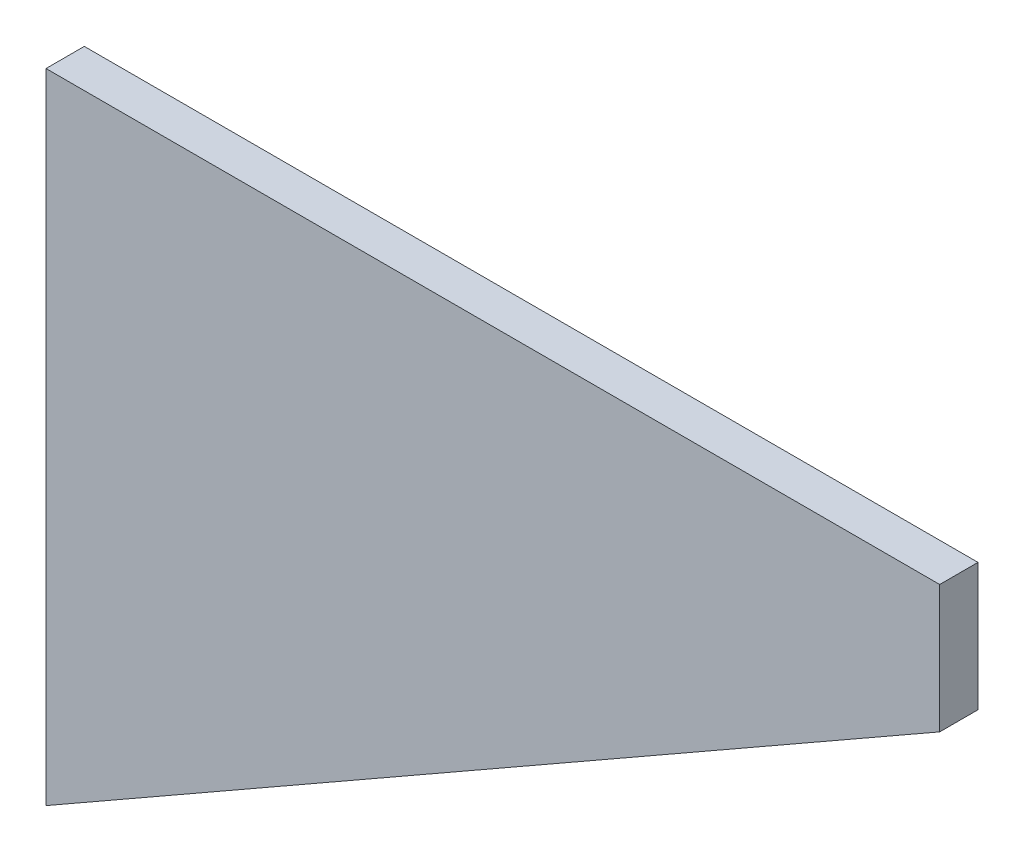
ISO-10303-21;
HEADER;
FILE_DESCRIPTION(('STEP AP214'),'2;1');
FILE_NAME('part.step','',(''),(''),'','','');
FILE_SCHEMA(('AUTOMOTIVE_DESIGN { 1 0 10303 214 1 1 1 1 }'));
ENDSEC;
DATA;
#1=APPLICATION_CONTEXT('core data for automotive mechanical design processes');
#2=APPLICATION_PROTOCOL_DEFINITION('international standard','automotive_design',2000,#1);
#3=PRODUCT_CONTEXT('',#1,'mechanical');
#4=PRODUCT('Part','Part','',(#3));
#5=PRODUCT_RELATED_PRODUCT_CATEGORY('part','',(#4));
#6=PRODUCT_DEFINITION_FORMATION('','',#4);
#7=PRODUCT_DEFINITION_CONTEXT('part definition',#1,'design');
#8=PRODUCT_DEFINITION('design','',#6,#7);
#9=PRODUCT_DEFINITION_SHAPE('','',#8);
#10=(LENGTH_UNIT() NAMED_UNIT(*) SI_UNIT(.MILLI.,.METRE.));
#11=(NAMED_UNIT(*) PLANE_ANGLE_UNIT() SI_UNIT($,.RADIAN.));
#12=(NAMED_UNIT(*) SI_UNIT($,.STERADIAN.) SOLID_ANGLE_UNIT());
#13=UNCERTAINTY_MEASURE_WITH_UNIT(LENGTH_MEASURE(1.E-05),#10,'distance_accuracy_value','');
#14=(GEOMETRIC_REPRESENTATION_CONTEXT(3) GLOBAL_UNCERTAINTY_ASSIGNED_CONTEXT((#13)) GLOBAL_UNIT_ASSIGNED_CONTEXT((#10,
#11,#12)) REPRESENTATION_CONTEXT('',''));
#15=CARTESIAN_POINT('',(0.,0.,0.));
#16=DIRECTION('',(0.,0.,1.));
#17=DIRECTION('',(1.,0.,0.));
#18=AXIS2_PLACEMENT_3D('',#15,#16,#17);
#19=CARTESIAN_POINT('',(140.,80.,6.));
#20=DIRECTION('',(-0.496138938356834,0.868243142124459,0.));
#21=DIRECTION('',(-0.868243142124459,-0.496138938356834,0.));
#22=AXIS2_PLACEMENT_3D('',#19,#20,#21);
#23=PLANE('',#22);
#24=DIRECTION('',(0.868243142124459,0.496138938356834,0.));
#25=VECTOR('',#24,1.);
#26=CARTESIAN_POINT('',(140.,80.,0.));
#27=LINE('',#26,#25);
#28=CARTESIAN_POINT('',(0.,0.,0.));
#29=VERTEX_POINT('',#28);
#30=CARTESIAN_POINT('',(140.,80.,0.));
#31=VERTEX_POINT('',#30);
#32=EDGE_CURVE('E99',#29,#31,#27,.T.);
#33=ORIENTED_EDGE('',*,*,#32,.T.);
#34=DIRECTION('',(0.,0.,-1.));
#35=VECTOR('',#34,1.);
#36=CARTESIAN_POINT('',(140.,80.,6.));
#37=LINE('',#36,#35);
#38=CARTESIAN_POINT('',(140.,80.,6.));
#39=VERTEX_POINT('',#38);
#40=EDGE_CURVE('E11',#39,#31,#37,.T.);
#41=ORIENTED_EDGE('',*,*,#40,.F.);
#42=DIRECTION('',(0.868243142124459,0.496138938356834,0.));
#43=VECTOR('',#42,1.);
#44=CARTESIAN_POINT('',(140.,80.,6.));
#45=LINE('',#44,#43);
#46=CARTESIAN_POINT('',(0.,0.,6.));
#47=VERTEX_POINT('',#46);
#48=EDGE_CURVE('E87',#47,#39,#45,.T.);
#49=ORIENTED_EDGE('',*,*,#48,.F.);
#50=DIRECTION('',(0.,0.,-1.));
#51=VECTOR('',#50,1.);
#52=CARTESIAN_POINT('',(0.,0.,6.));
#53=LINE('',#52,#51);
#54=EDGE_CURVE('E95',#47,#29,#53,.T.);
#55=ORIENTED_EDGE('',*,*,#54,.T.);
#56=EDGE_LOOP('',(#33,#41,#49,#55));
#57=FACE_BOUND('',#56,.T.);
#58=ADVANCED_FACE('F36',(#57),#23,.F.);
#59=CARTESIAN_POINT('',(140.,100.,6.));
#60=DIRECTION('',(-1.,0.,0.));
#61=DIRECTION('',(0.,0.,1.));
#62=AXIS2_PLACEMENT_3D('',#59,#60,#61);
#63=PLANE('',#62);
#64=DIRECTION('',(0.,1.,0.));
#65=VECTOR('',#64,1.);
#66=CARTESIAN_POINT('',(140.,100.,0.));
#67=LINE('',#66,#65);
#68=CARTESIAN_POINT('',(140.,100.,0.));
#69=VERTEX_POINT('',#68);
#70=EDGE_CURVE('E91',#31,#69,#67,.T.);
#71=ORIENTED_EDGE('',*,*,#70,.T.);
#72=DIRECTION('',(0.,0.,-1.));
#73=VECTOR('',#72,1.);
#74=CARTESIAN_POINT('',(140.,100.,6.));
#75=LINE('',#74,#73);
#76=CARTESIAN_POINT('',(140.,100.,6.));
#77=VERTEX_POINT('',#76);
#78=EDGE_CURVE('E44',#77,#69,#75,.T.);
#79=ORIENTED_EDGE('',*,*,#78,.F.);
#80=DIRECTION('',(0.,1.,0.));
#81=VECTOR('',#80,1.);
#82=CARTESIAN_POINT('',(140.,100.,6.));
#83=LINE('',#82,#81);
#84=EDGE_CURVE('E82',#39,#77,#83,.T.);
#85=ORIENTED_EDGE('',*,*,#84,.F.);
#86=ORIENTED_EDGE('',*,*,#40,.T.);
#87=EDGE_LOOP('',(#71,#79,#85,#86));
#88=FACE_BOUND('',#87,.T.);
#89=ADVANCED_FACE('F90',(#88),#63,.F.);
#90=CARTESIAN_POINT('',(0.,100.,6.));
#91=DIRECTION('',(0.,-1.,0.));
#92=DIRECTION('',(0.,0.,-1.));
#93=AXIS2_PLACEMENT_3D('',#90,#91,#92);
#94=PLANE('',#93);
#95=DIRECTION('',(-1.,0.,0.));
#96=VECTOR('',#95,1.);
#97=CARTESIAN_POINT('',(0.,100.,0.));
#98=LINE('',#97,#96);
#99=CARTESIAN_POINT('',(0.,100.,0.));
#100=VERTEX_POINT('',#99);
#101=EDGE_CURVE('E69',#69,#100,#98,.T.);
#102=ORIENTED_EDGE('',*,*,#101,.T.);
#103=DIRECTION('',(0.,0.,-1.));
#104=VECTOR('',#103,1.);
#105=CARTESIAN_POINT('',(0.,100.,6.));
#106=LINE('',#105,#104);
#107=CARTESIAN_POINT('',(0.,100.,6.));
#108=VERTEX_POINT('',#107);
#109=EDGE_CURVE('E92',#108,#100,#106,.T.);
#110=ORIENTED_EDGE('',*,*,#109,.F.);
#111=DIRECTION('',(-1.,0.,0.));
#112=VECTOR('',#111,1.);
#113=CARTESIAN_POINT('',(0.,100.,6.));
#114=LINE('',#113,#112);
#115=EDGE_CURVE('E85',#77,#108,#114,.T.);
#116=ORIENTED_EDGE('',*,*,#115,.F.);
#117=ORIENTED_EDGE('',*,*,#78,.T.);
#118=EDGE_LOOP('',(#102,#110,#116,#117));
#119=FACE_BOUND('',#118,.T.);
#120=ADVANCED_FACE('F93',(#119),#94,.F.);
#121=CARTESIAN_POINT('',(0.,0.,6.));
#122=DIRECTION('',(1.,0.,0.));
#123=DIRECTION('',(0.,0.,-1.));
#124=AXIS2_PLACEMENT_3D('',#121,#122,#123);
#125=PLANE('',#124);
#126=DIRECTION('',(0.,-1.,0.));
#127=VECTOR('',#126,1.);
#128=CARTESIAN_POINT('',(0.,0.,0.));
#129=LINE('',#128,#127);
#130=EDGE_CURVE('E75',#100,#29,#129,.T.);
#131=ORIENTED_EDGE('',*,*,#130,.T.);
#132=ORIENTED_EDGE('',*,*,#54,.F.);
#133=DIRECTION('',(0.,-1.,0.));
#134=VECTOR('',#133,1.);
#135=CARTESIAN_POINT('',(0.,0.,6.));
#136=LINE('',#135,#134);
#137=EDGE_CURVE('E52',#108,#47,#136,.T.);
#138=ORIENTED_EDGE('',*,*,#137,.F.);
#139=ORIENTED_EDGE('',*,*,#109,.T.);
#140=EDGE_LOOP('',(#131,#132,#138,#139));
#141=FACE_BOUND('',#140,.T.);
#142=ADVANCED_FACE('F106',(#141),#125,.F.);
#143=CARTESIAN_POINT('',(0.,0.,6.));
#144=DIRECTION('',(0.,0.,-1.));
#145=DIRECTION('',(-1.,0.,0.));
#146=AXIS2_PLACEMENT_3D('',#143,#144,#145);
#147=PLANE('',#146);
#148=ORIENTED_EDGE('',*,*,#48,.T.);
#149=ORIENTED_EDGE('',*,*,#84,.T.);
#150=ORIENTED_EDGE('',*,*,#115,.T.);
#151=ORIENTED_EDGE('',*,*,#137,.T.);
#152=EDGE_LOOP('',(#148,#149,#150,#151));
#153=FACE_BOUND('',#152,.T.);
#154=ADVANCED_FACE('F83',(#153),#147,.F.);
#155=CARTESIAN_POINT('',(0.,0.,0.));
#156=DIRECTION('',(0.,0.,-1.));
#157=DIRECTION('',(-1.,0.,0.));
#158=AXIS2_PLACEMENT_3D('',#155,#156,#157);
#159=PLANE('',#158);
#160=ORIENTED_EDGE('',*,*,#32,.F.);
#161=ORIENTED_EDGE('',*,*,#130,.F.);
#162=ORIENTED_EDGE('',*,*,#101,.F.);
#163=ORIENTED_EDGE('',*,*,#70,.F.);
#164=EDGE_LOOP('',(#160,#161,#162,#163));
#165=FACE_BOUND('',#164,.T.);
#166=ADVANCED_FACE('F109',(#165),#159,.T.);
#167=CLOSED_SHELL('',(#58,#89,#120,#142,#154,#166));
#168=MANIFOLD_SOLID_BREP('B2',#167);
#169=ADVANCED_BREP_SHAPE_REPRESENTATION('',(#18,#168),#14);
#170=SHAPE_DEFINITION_REPRESENTATION(#9,#169);
ENDSEC;
END-ISO-10303-21;
